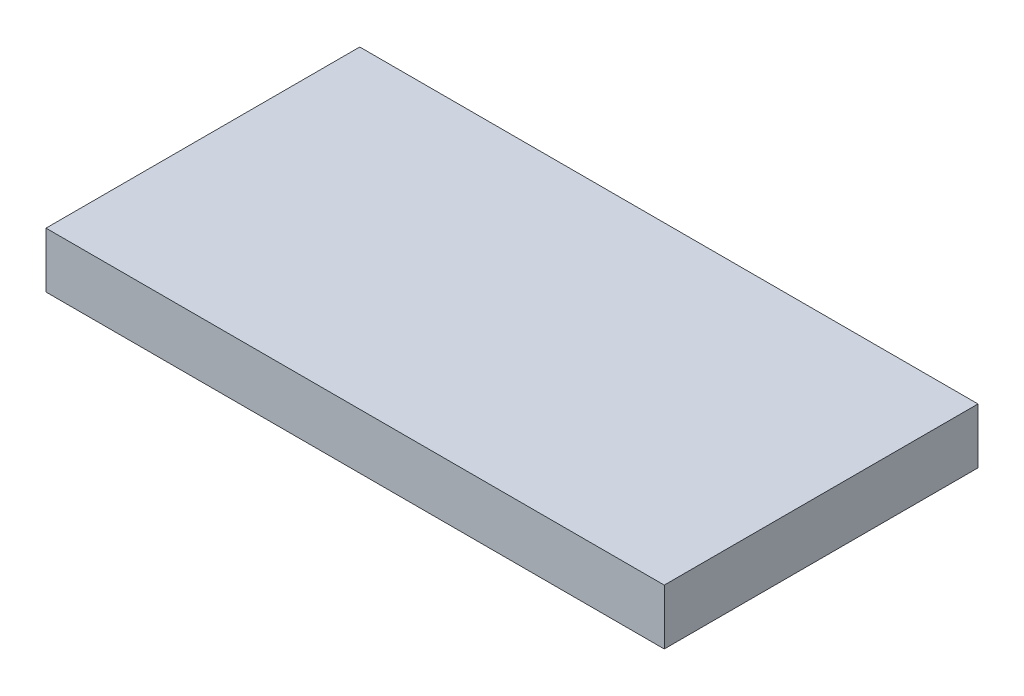
ISO-10303-21;
HEADER;
FILE_DESCRIPTION(('STEP AP214'),'2;1');
FILE_NAME('part.step','',(''),(''),'','','');
FILE_SCHEMA(('AUTOMOTIVE_DESIGN { 1 0 10303 214 1 1 1 1 }'));
ENDSEC;
DATA;
#1=APPLICATION_CONTEXT('core data for automotive mechanical design processes');
#2=APPLICATION_PROTOCOL_DEFINITION('international standard','automotive_design',2000,#1);
#3=PRODUCT_CONTEXT('',#1,'mechanical');
#4=PRODUCT('Part','Part','',(#3));
#5=PRODUCT_RELATED_PRODUCT_CATEGORY('part','',(#4));
#6=PRODUCT_DEFINITION_FORMATION('','',#4);
#7=PRODUCT_DEFINITION_CONTEXT('part definition',#1,'design');
#8=PRODUCT_DEFINITION('design','',#6,#7);
#9=PRODUCT_DEFINITION_SHAPE('','',#8);
#10=(LENGTH_UNIT() NAMED_UNIT(*) SI_UNIT(.MILLI.,.METRE.));
#11=(NAMED_UNIT(*) PLANE_ANGLE_UNIT() SI_UNIT($,.RADIAN.));
#12=(NAMED_UNIT(*) SI_UNIT($,.STERADIAN.) SOLID_ANGLE_UNIT());
#13=UNCERTAINTY_MEASURE_WITH_UNIT(LENGTH_MEASURE(1.E-05),#10,'distance_accuracy_value','');
#14=(GEOMETRIC_REPRESENTATION_CONTEXT(3) GLOBAL_UNCERTAINTY_ASSIGNED_CONTEXT((#13)) GLOBAL_UNIT_ASSIGNED_CONTEXT((#10,
#11,#12)) REPRESENTATION_CONTEXT('',''));
#15=CARTESIAN_POINT('',(0.,0.,0.));
#16=DIRECTION('',(0.,0.,1.));
#17=DIRECTION('',(1.,0.,0.));
#18=AXIS2_PLACEMENT_3D('',#15,#16,#17);
#19=CARTESIAN_POINT('',(0.,6.,0.));
#20=DIRECTION('',(1.,0.,0.));
#21=DIRECTION('',(0.,0.,-1.));
#22=AXIS2_PLACEMENT_3D('',#19,#20,#21);
#23=PLANE('',#22);
#24=DIRECTION('',(0.,0.,1.));
#25=VECTOR('',#24,1.);
#26=CARTESIAN_POINT('',(0.,0.,0.));
#27=LINE('',#26,#25);
#28=CARTESIAN_POINT('',(0.,0.,-34.));
#29=VERTEX_POINT('',#28);
#30=CARTESIAN_POINT('',(0.,0.,0.));
#31=VERTEX_POINT('',#30);
#32=EDGE_CURVE('E96',#29,#31,#27,.T.);
#33=ORIENTED_EDGE('',*,*,#32,.T.);
#34=DIRECTION('',(0.,-1.,0.));
#35=VECTOR('',#34,1.);
#36=CARTESIAN_POINT('',(0.,6.,0.));
#37=LINE('',#36,#35);
#38=CARTESIAN_POINT('',(0.,6.,0.));
#39=VERTEX_POINT('',#38);
#40=EDGE_CURVE('E11',#39,#31,#37,.T.);
#41=ORIENTED_EDGE('',*,*,#40,.F.);
#42=DIRECTION('',(0.,0.,1.));
#43=VECTOR('',#42,1.);
#44=CARTESIAN_POINT('',(0.,6.,0.));
#45=LINE('',#44,#43);
#46=CARTESIAN_POINT('',(0.,6.,-34.));
#47=VERTEX_POINT('',#46);
#48=EDGE_CURVE('E84',#47,#39,#45,.T.);
#49=ORIENTED_EDGE('',*,*,#48,.F.);
#50=DIRECTION('',(0.,-1.,0.));
#51=VECTOR('',#50,1.);
#52=CARTESIAN_POINT('',(0.,6.,-34.));
#53=LINE('',#52,#51);
#54=EDGE_CURVE('E92',#47,#29,#53,.T.);
#55=ORIENTED_EDGE('',*,*,#54,.T.);
#56=EDGE_LOOP('',(#33,#41,#49,#55));
#57=FACE_BOUND('',#56,.T.);
#58=ADVANCED_FACE('F33',(#57),#23,.F.);
#59=CARTESIAN_POINT('',(0.,6.,0.));
#60=DIRECTION('',(0.,0.,-1.));
#61=DIRECTION('',(-1.,0.,0.));
#62=AXIS2_PLACEMENT_3D('',#59,#60,#61);
#63=PLANE('',#62);
#64=DIRECTION('',(1.,0.,0.));
#65=VECTOR('',#64,1.);
#66=CARTESIAN_POINT('',(0.,0.,0.));
#67=LINE('',#66,#65);
#68=CARTESIAN_POINT('',(67.,0.,0.));
#69=VERTEX_POINT('',#68);
#70=EDGE_CURVE('E88',#31,#69,#67,.T.);
#71=ORIENTED_EDGE('',*,*,#70,.T.);
#72=DIRECTION('',(0.,-1.,0.));
#73=VECTOR('',#72,1.);
#74=CARTESIAN_POINT('',(67.,6.,0.));
#75=LINE('',#74,#73);
#76=CARTESIAN_POINT('',(67.,6.,0.));
#77=VERTEX_POINT('',#76);
#78=EDGE_CURVE('E41',#77,#69,#75,.T.);
#79=ORIENTED_EDGE('',*,*,#78,.F.);
#80=DIRECTION('',(1.,0.,0.));
#81=VECTOR('',#80,1.);
#82=CARTESIAN_POINT('',(0.,6.,0.));
#83=LINE('',#82,#81);
#84=EDGE_CURVE('E79',#39,#77,#83,.T.);
#85=ORIENTED_EDGE('',*,*,#84,.F.);
#86=ORIENTED_EDGE('',*,*,#40,.T.);
#87=EDGE_LOOP('',(#71,#79,#85,#86));
#88=FACE_BOUND('',#87,.T.);
#89=ADVANCED_FACE('F87',(#88),#63,.F.);
#90=CARTESIAN_POINT('',(67.,6.,0.));
#91=DIRECTION('',(-1.,0.,0.));
#92=DIRECTION('',(0.,0.,1.));
#93=AXIS2_PLACEMENT_3D('',#90,#91,#92);
#94=PLANE('',#93);
#95=DIRECTION('',(0.,0.,-1.));
#96=VECTOR('',#95,1.);
#97=CARTESIAN_POINT('',(67.,0.,0.));
#98=LINE('',#97,#96);
#99=CARTESIAN_POINT('',(67.,0.,-34.));
#100=VERTEX_POINT('',#99);
#101=EDGE_CURVE('E66',#69,#100,#98,.T.);
#102=ORIENTED_EDGE('',*,*,#101,.T.);
#103=DIRECTION('',(0.,-1.,0.));
#104=VECTOR('',#103,1.);
#105=CARTESIAN_POINT('',(67.,6.,-34.));
#106=LINE('',#105,#104);
#107=CARTESIAN_POINT('',(67.,6.,-34.));
#108=VERTEX_POINT('',#107);
#109=EDGE_CURVE('E89',#108,#100,#106,.T.);
#110=ORIENTED_EDGE('',*,*,#109,.F.);
#111=DIRECTION('',(0.,0.,-1.));
#112=VECTOR('',#111,1.);
#113=CARTESIAN_POINT('',(67.,6.,0.));
#114=LINE('',#113,#112);
#115=EDGE_CURVE('E82',#77,#108,#114,.T.);
#116=ORIENTED_EDGE('',*,*,#115,.F.);
#117=ORIENTED_EDGE('',*,*,#78,.T.);
#118=EDGE_LOOP('',(#102,#110,#116,#117));
#119=FACE_BOUND('',#118,.T.);
#120=ADVANCED_FACE('F90',(#119),#94,.F.);
#121=CARTESIAN_POINT('',(0.,6.,-34.));
#122=DIRECTION('',(0.,0.,1.));
#123=DIRECTION('',(1.,0.,0.));
#124=AXIS2_PLACEMENT_3D('',#121,#122,#123);
#125=PLANE('',#124);
#126=DIRECTION('',(-1.,0.,0.));
#127=VECTOR('',#126,1.);
#128=CARTESIAN_POINT('',(0.,0.,-34.));
#129=LINE('',#128,#127);
#130=EDGE_CURVE('E72',#100,#29,#129,.T.);
#131=ORIENTED_EDGE('',*,*,#130,.T.);
#132=ORIENTED_EDGE('',*,*,#54,.F.);
#133=DIRECTION('',(-1.,0.,0.));
#134=VECTOR('',#133,1.);
#135=CARTESIAN_POINT('',(0.,6.,-34.));
#136=LINE('',#135,#134);
#137=EDGE_CURVE('E49',#108,#47,#136,.T.);
#138=ORIENTED_EDGE('',*,*,#137,.F.);
#139=ORIENTED_EDGE('',*,*,#109,.T.);
#140=EDGE_LOOP('',(#131,#132,#138,#139));
#141=FACE_BOUND('',#140,.T.);
#142=ADVANCED_FACE('F103',(#141),#125,.F.);
#143=CARTESIAN_POINT('',(0.,6.,0.));
#144=DIRECTION('',(0.,-1.,0.));
#145=DIRECTION('',(0.,0.,-1.));
#146=AXIS2_PLACEMENT_3D('',#143,#144,#145);
#147=PLANE('',#146);
#148=ORIENTED_EDGE('',*,*,#48,.T.);
#149=ORIENTED_EDGE('',*,*,#84,.T.);
#150=ORIENTED_EDGE('',*,*,#115,.T.);
#151=ORIENTED_EDGE('',*,*,#137,.T.);
#152=EDGE_LOOP('',(#148,#149,#150,#151));
#153=FACE_BOUND('',#152,.T.);
#154=ADVANCED_FACE('F80',(#153),#147,.F.);
#155=CARTESIAN_POINT('',(0.,0.,0.));
#156=DIRECTION('',(0.,-1.,0.));
#157=DIRECTION('',(0.,0.,-1.));
#158=AXIS2_PLACEMENT_3D('',#155,#156,#157);
#159=PLANE('',#158);
#160=ORIENTED_EDGE('',*,*,#32,.F.);
#161=ORIENTED_EDGE('',*,*,#130,.F.);
#162=ORIENTED_EDGE('',*,*,#101,.F.);
#163=ORIENTED_EDGE('',*,*,#70,.F.);
#164=EDGE_LOOP('',(#160,#161,#162,#163));
#165=FACE_BOUND('',#164,.T.);
#166=ADVANCED_FACE('F106',(#165),#159,.T.);
#167=CLOSED_SHELL('',(#58,#89,#120,#142,#154,#166));
#168=MANIFOLD_SOLID_BREP('B2',#167);
#169=ADVANCED_BREP_SHAPE_REPRESENTATION('',(#18,#168),#14);
#170=SHAPE_DEFINITION_REPRESENTATION(#9,#169);
ENDSEC;
END-ISO-10303-21;
